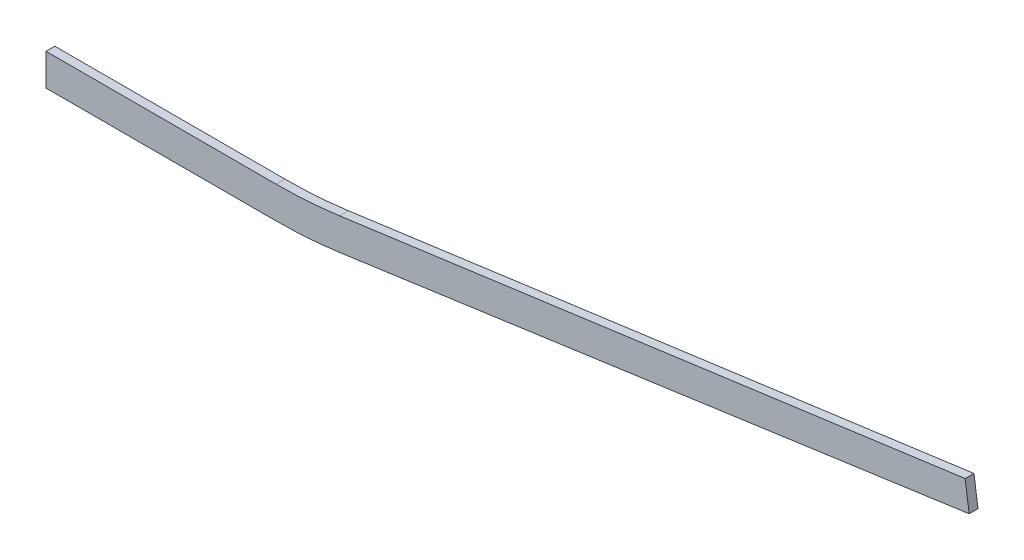
ISO-10303-21;
HEADER;
FILE_DESCRIPTION(('STEP AP214'),'2;1');
FILE_NAME('part.step','',(''),(''),'','','');
FILE_SCHEMA(('AUTOMOTIVE_DESIGN { 1 0 10303 214 1 1 1 1 }'));
ENDSEC;
DATA;
#1=APPLICATION_CONTEXT('core data for automotive mechanical design processes');
#2=APPLICATION_PROTOCOL_DEFINITION('international standard','automotive_design',2000,#1);
#3=PRODUCT_CONTEXT('',#1,'mechanical');
#4=PRODUCT('Part','Part','',(#3));
#5=PRODUCT_RELATED_PRODUCT_CATEGORY('part','',(#4));
#6=PRODUCT_DEFINITION_FORMATION('','',#4);
#7=PRODUCT_DEFINITION_CONTEXT('part definition',#1,'design');
#8=PRODUCT_DEFINITION('design','',#6,#7);
#9=PRODUCT_DEFINITION_SHAPE('','',#8);
#10=(LENGTH_UNIT() NAMED_UNIT(*) SI_UNIT(.MILLI.,.METRE.));
#11=(NAMED_UNIT(*) PLANE_ANGLE_UNIT() SI_UNIT($,.RADIAN.));
#12=(NAMED_UNIT(*) SI_UNIT($,.STERADIAN.) SOLID_ANGLE_UNIT());
#13=UNCERTAINTY_MEASURE_WITH_UNIT(LENGTH_MEASURE(1.E-05),#10,'distance_accuracy_value','');
#14=(GEOMETRIC_REPRESENTATION_CONTEXT(3) GLOBAL_UNCERTAINTY_ASSIGNED_CONTEXT((#13)) GLOBAL_UNIT_ASSIGNED_CONTEXT((#10,
#11,#12)) REPRESENTATION_CONTEXT('',''));
#15=CARTESIAN_POINT('',(0.,0.,0.));
#16=DIRECTION('',(0.,0.,1.));
#17=DIRECTION('',(1.,0.,0.));
#18=AXIS2_PLACEMENT_3D('',#15,#16,#17);
#19=CARTESIAN_POINT('',(3698.44778485167,2129.44349002792,9.525));
#20=DIRECTION('',(0.,1.,0.));
#21=DIRECTION('',(-1.,0.,0.));
#22=AXIS2_PLACEMENT_3D('',#19,#20,#21);
#23=PLANE('',#22);
#24=DIRECTION('',(1.,0.,0.));
#25=VECTOR('',#24,1.);
#26=CARTESIAN_POINT('',(3698.44778485167,2129.44349002792,0.));
#27=LINE('',#26,#25);
#28=CARTESIAN_POINT('',(3698.44778485167,2129.44349002792,0.));
#29=VERTEX_POINT('',#28);
#30=CARTESIAN_POINT('',(3945.49996438437,2129.44349002792,0.));
#31=VERTEX_POINT('',#30);
#32=EDGE_CURVE('E131',#29,#31,#27,.T.);
#33=ORIENTED_EDGE('',*,*,#32,.T.);
#34=DIRECTION('',(0.,0.,-1.));
#35=VECTOR('',#34,1.);
#36=CARTESIAN_POINT('',(3945.49996438437,2129.44349002792,9.525));
#37=LINE('',#36,#35);
#38=CARTESIAN_POINT('',(3945.49996438437,2129.44349002792,9.525));
#39=VERTEX_POINT('',#38);
#40=EDGE_CURVE('E11',#39,#31,#37,.T.);
#41=ORIENTED_EDGE('',*,*,#40,.F.);
#42=DIRECTION('',(1.,0.,0.));
#43=VECTOR('',#42,1.);
#44=CARTESIAN_POINT('',(3698.44778485167,2129.44349002792,9.525));
#45=LINE('',#44,#43);
#46=CARTESIAN_POINT('',(3698.44778485167,2129.44349002792,9.525));
#47=VERTEX_POINT('',#46);
#48=EDGE_CURVE('E145',#47,#39,#45,.T.);
#49=ORIENTED_EDGE('',*,*,#48,.F.);
#50=DIRECTION('',(0.,0.,-1.));
#51=VECTOR('',#50,1.);
#52=CARTESIAN_POINT('',(3698.44778485167,2129.44349002792,9.525));
#53=LINE('',#52,#51);
#54=EDGE_CURVE('E127',#47,#29,#53,.T.);
#55=ORIENTED_EDGE('',*,*,#54,.T.);
#56=EDGE_LOOP('',(#33,#41,#49,#55));
#57=FACE_BOUND('',#56,.T.);
#58=ADVANCED_FACE('F35',(#57),#23,.F.);
#59=CARTESIAN_POINT('',(3945.49996438437,2637.44349002792,9.525));
#60=DIRECTION('',(0.,0.,-1.));
#61=DIRECTION('',(-1.,0.,0.));
#62=AXIS2_PLACEMENT_3D('',#59,#60,#61);
#63=CYLINDRICAL_SURFACE('',#62,508.);
#64=CARTESIAN_POINT('',(3945.49996438437,2637.44349002792,0.));
#65=DIRECTION('',(0.,0.,1.));
#66=DIRECTION('',(1.,0.,0.));
#67=AXIS2_PLACEMENT_3D('',#64,#65,#66);
#68=CIRCLE('',#67,508.);
#69=CARTESIAN_POINT('',(4016.19989967208,2134.3873111072,0.));
#70=VERTEX_POINT('',#69);
#71=EDGE_CURVE('E134',#31,#70,#68,.T.);
#72=ORIENTED_EDGE('',*,*,#71,.T.);
#73=DIRECTION('',(0.,0.,-1.));
#74=VECTOR('',#73,1.);
#75=CARTESIAN_POINT('',(4016.19989967208,2134.3873111072,9.525));
#76=LINE('',#75,#74);
#77=CARTESIAN_POINT('',(4016.19989967208,2134.3873111072,9.525));
#78=VERTEX_POINT('',#77);
#79=EDGE_CURVE('E43',#78,#70,#76,.T.);
#80=ORIENTED_EDGE('',*,*,#79,.F.);
#81=CARTESIAN_POINT('',(3945.49996438437,2637.44349002792,9.525));
#82=DIRECTION('',(0.,0.,1.));
#83=DIRECTION('',(1.,0.,0.));
#84=AXIS2_PLACEMENT_3D('',#81,#82,#83);
#85=CIRCLE('',#84,508.);
#86=EDGE_CURVE('E94',#39,#78,#85,.T.);
#87=ORIENTED_EDGE('',*,*,#86,.F.);
#88=ORIENTED_EDGE('',*,*,#40,.T.);
#89=EDGE_LOOP('',(#72,#80,#87,#88));
#90=FACE_BOUND('',#89,.T.);
#91=ADVANCED_FACE('F180',(#90),#63,.T.);
#92=CARTESIAN_POINT('',(4016.19989967208,2134.3873111072,9.525));
#93=DIRECTION('',(-0.139173100960063,0.990268068741571,0.));
#94=DIRECTION('',(-0.990268068741571,-0.139173100960063,0.));
#95=AXIS2_PLACEMENT_3D('',#92,#93,#94);
#96=PLANE('',#95);
#97=DIRECTION('',(0.990268068741571,0.139173100960063,0.));
#98=VECTOR('',#97,1.);
#99=CARTESIAN_POINT('',(4016.19989967208,2134.3873111072,0.));
#100=LINE('',#99,#98);
#101=CARTESIAN_POINT('',(4694.39778485168,2229.70180798374,0.));
#102=VERTEX_POINT('',#101);
#103=EDGE_CURVE('E136',#70,#102,#100,.T.);
#104=ORIENTED_EDGE('',*,*,#103,.T.);
#105=DIRECTION('',(0.,0.,-1.));
#106=VECTOR('',#105,1.);
#107=CARTESIAN_POINT('',(4694.39778485168,2229.70180798374,9.525));
#108=LINE('',#107,#106);
#109=CARTESIAN_POINT('',(4694.39778485168,2229.70180798374,9.525));
#110=VERTEX_POINT('',#109);
#111=EDGE_CURVE('E152',#110,#102,#108,.T.);
#112=ORIENTED_EDGE('',*,*,#111,.F.);
#113=DIRECTION('',(0.990268068741571,0.139173100960063,0.));
#114=VECTOR('',#113,1.);
#115=CARTESIAN_POINT('',(4016.19989967208,2134.3873111072,9.525));
#116=LINE('',#115,#114);
#117=EDGE_CURVE('E160',#78,#110,#116,.T.);
#118=ORIENTED_EDGE('',*,*,#117,.F.);
#119=ORIENTED_EDGE('',*,*,#79,.T.);
#120=EDGE_LOOP('',(#104,#112,#118,#119));
#121=FACE_BOUND('',#120,.T.);
#122=ADVANCED_FACE('F158',(#121),#96,.F.);
#123=CARTESIAN_POINT('',(4694.39778485168,2229.70180798374,9.525));
#124=DIRECTION('',(-0.99026806874157,-0.139173100960068,0.));
#125=DIRECTION('',(0.139173100960068,-0.99026806874157,0.));
#126=AXIS2_PLACEMENT_3D('',#123,#124,#125);
#127=PLANE('',#126);
#128=DIRECTION('',(-0.139173100960068,0.99026806874157,0.));
#129=VECTOR('',#128,1.);
#130=CARTESIAN_POINT('',(4694.39778485168,2229.70180798374,0.));
#131=LINE('',#130,#129);
#132=CARTESIAN_POINT('',(4690.07128854497,2260.48642880851,0.));
#133=VERTEX_POINT('',#132);
#134=EDGE_CURVE('E138',#102,#133,#131,.T.);
#135=ORIENTED_EDGE('',*,*,#134,.T.);
#136=DIRECTION('',(0.,0.,-1.));
#137=VECTOR('',#136,1.);
#138=CARTESIAN_POINT('',(4690.07128854497,2260.48642880851,9.525));
#139=LINE('',#138,#137);
#140=CARTESIAN_POINT('',(4690.07128854497,2260.48642880851,9.525));
#141=VERTEX_POINT('',#140);
#142=EDGE_CURVE('E149',#141,#133,#139,.T.);
#143=ORIENTED_EDGE('',*,*,#142,.F.);
#144=DIRECTION('',(-0.139173100960068,0.99026806874157,0.));
#145=VECTOR('',#144,1.);
#146=CARTESIAN_POINT('',(4694.39778485168,2229.70180798374,9.525));
#147=LINE('',#146,#145);
#148=EDGE_CURVE('E172',#110,#141,#147,.T.);
#149=ORIENTED_EDGE('',*,*,#148,.F.);
#150=ORIENTED_EDGE('',*,*,#111,.T.);
#151=EDGE_LOOP('',(#135,#143,#149,#150));
#152=FACE_BOUND('',#151,.T.);
#153=ADVANCED_FACE('F168',(#152),#127,.F.);
#154=CARTESIAN_POINT('',(4015.17134913609,2168.48818137953,9.525));
#155=DIRECTION('',(0.135064830199822,-0.990836763368767,0.));
#156=DIRECTION('',(0.990836763368767,0.135064830199822,0.));
#157=AXIS2_PLACEMENT_3D('',#154,#155,#156);
#158=PLANE('',#157);
#159=DIRECTION('',(-0.990836763368767,-0.135064830199822,0.));
#160=VECTOR('',#159,1.);
#161=CARTESIAN_POINT('',(4015.17134913609,2168.48818137953,0.));
#162=LINE('',#161,#160);
#163=CARTESIAN_POINT('',(4015.17134913609,2168.48818137953,0.));
#164=VERTEX_POINT('',#163);
#165=EDGE_CURVE('E140',#133,#164,#162,.T.);
#166=ORIENTED_EDGE('',*,*,#165,.T.);
#167=DIRECTION('',(0.,0.,-1.));
#168=VECTOR('',#167,1.);
#169=CARTESIAN_POINT('',(4015.17134913609,2168.48818137953,9.525));
#170=LINE('',#169,#168);
#171=CARTESIAN_POINT('',(4015.17134913609,2168.48818137953,9.525));
#172=VERTEX_POINT('',#171);
#173=EDGE_CURVE('E122',#172,#164,#170,.T.);
#174=ORIENTED_EDGE('',*,*,#173,.F.);
#175=DIRECTION('',(-0.990836763368767,-0.135064830199822,0.));
#176=VECTOR('',#175,1.);
#177=CARTESIAN_POINT('',(4015.17134913609,2168.48818137953,9.525));
#178=LINE('',#177,#176);
#179=EDGE_CURVE('E113',#141,#172,#178,.T.);
#180=ORIENTED_EDGE('',*,*,#179,.F.);
#181=ORIENTED_EDGE('',*,*,#142,.T.);
#182=EDGE_LOOP('',(#166,#174,#180,#181));
#183=FACE_BOUND('',#182,.T.);
#184=ADVANCED_FACE('F171',(#183),#158,.F.);
#185=CARTESIAN_POINT('',(3946.55841539458,2671.83325717087,9.525));
#186=DIRECTION('',(0.,0.,-1.));
#187=DIRECTION('',(-1.,0.,0.));
#188=AXIS2_PLACEMENT_3D('',#185,#186,#187);
#189=CYLINDRICAL_SURFACE('',#188,508.);
#190=CARTESIAN_POINT('',(3946.55841539458,2671.83325717087,0.));
#191=DIRECTION('',(0.,0.,-1.));
#192=DIRECTION('',(1.,0.,0.));
#193=AXIS2_PLACEMENT_3D('',#190,#191,#192);
#194=CIRCLE('',#193,508.);
#195=CARTESIAN_POINT('',(3946.55841539458,2163.83325717087,0.));
#196=VERTEX_POINT('',#195);
#197=EDGE_CURVE('E121',#164,#196,#194,.T.);
#198=ORIENTED_EDGE('',*,*,#197,.T.);
#199=DIRECTION('',(0.,0.,-1.));
#200=VECTOR('',#199,1.);
#201=CARTESIAN_POINT('',(3946.55841539458,2163.83325717087,9.525));
#202=LINE('',#201,#200);
#203=CARTESIAN_POINT('',(3946.55841539458,2163.83325717087,9.525));
#204=VERTEX_POINT('',#203);
#205=EDGE_CURVE('E118',#204,#196,#202,.T.);
#206=ORIENTED_EDGE('',*,*,#205,.F.);
#207=CARTESIAN_POINT('',(3946.55841539458,2671.83325717087,9.525));
#208=DIRECTION('',(0.,0.,-1.));
#209=DIRECTION('',(1.,0.,0.));
#210=AXIS2_PLACEMENT_3D('',#207,#208,#209);
#211=CIRCLE('',#210,508.);
#212=EDGE_CURVE('E107',#172,#204,#211,.T.);
#213=ORIENTED_EDGE('',*,*,#212,.F.);
#214=ORIENTED_EDGE('',*,*,#173,.T.);
#215=EDGE_LOOP('',(#198,#206,#213,#214));
#216=FACE_BOUND('',#215,.T.);
#217=ADVANCED_FACE('F119',(#216),#189,.F.);
#218=CARTESIAN_POINT('',(3698.44778485167,2163.83325717087,9.525));
#219=DIRECTION('',(0.,-1.,0.));
#220=DIRECTION('',(0.,0.,-1.));
#221=AXIS2_PLACEMENT_3D('',#218,#219,#220);
#222=PLANE('',#221);
#223=DIRECTION('',(-1.,0.,0.));
#224=VECTOR('',#223,1.);
#225=CARTESIAN_POINT('',(3698.44778485167,2163.83325717087,0.));
#226=LINE('',#225,#224);
#227=CARTESIAN_POINT('',(3698.44778485167,2163.83325717087,0.));
#228=VERTEX_POINT('',#227);
#229=EDGE_CURVE('E80',#196,#228,#226,.T.);
#230=ORIENTED_EDGE('',*,*,#229,.T.);
#231=DIRECTION('',(0.,0.,-1.));
#232=VECTOR('',#231,1.);
#233=CARTESIAN_POINT('',(3698.44778485167,2163.83325717087,9.525));
#234=LINE('',#233,#232);
#235=CARTESIAN_POINT('',(3698.44778485167,2163.83325717087,9.525));
#236=VERTEX_POINT('',#235);
#237=EDGE_CURVE('E123',#236,#228,#234,.T.);
#238=ORIENTED_EDGE('',*,*,#237,.F.);
#239=DIRECTION('',(-1.,0.,0.));
#240=VECTOR('',#239,1.);
#241=CARTESIAN_POINT('',(3698.44778485167,2163.83325717087,9.525));
#242=LINE('',#241,#240);
#243=EDGE_CURVE('E111',#204,#236,#242,.T.);
#244=ORIENTED_EDGE('',*,*,#243,.F.);
#245=ORIENTED_EDGE('',*,*,#205,.T.);
#246=EDGE_LOOP('',(#230,#238,#244,#245));
#247=FACE_BOUND('',#246,.T.);
#248=ADVANCED_FACE('F125',(#247),#222,.F.);
#249=CARTESIAN_POINT('',(3698.44778485167,2129.44349002792,9.525));
#250=DIRECTION('',(1.,0.,0.));
#251=DIRECTION('',(0.,0.,-1.));
#252=AXIS2_PLACEMENT_3D('',#249,#250,#251);
#253=PLANE('',#252);
#254=DIRECTION('',(0.,-1.,0.));
#255=VECTOR('',#254,1.);
#256=CARTESIAN_POINT('',(3698.44778485167,2129.44349002792,0.));
#257=LINE('',#256,#255);
#258=EDGE_CURVE('E86',#228,#29,#257,.T.);
#259=ORIENTED_EDGE('',*,*,#258,.T.);
#260=ORIENTED_EDGE('',*,*,#54,.F.);
#261=DIRECTION('',(0.,-1.,0.));
#262=VECTOR('',#261,1.);
#263=CARTESIAN_POINT('',(3698.44778485167,2129.44349002792,9.525));
#264=LINE('',#263,#262);
#265=EDGE_CURVE('E51',#236,#47,#264,.T.);
#266=ORIENTED_EDGE('',*,*,#265,.F.);
#267=ORIENTED_EDGE('',*,*,#237,.T.);
#268=EDGE_LOOP('',(#259,#260,#266,#267));
#269=FACE_BOUND('',#268,.T.);
#270=ADVANCED_FACE('F196',(#269),#253,.F.);
#271=CARTESIAN_POINT('',(3945.49996438437,2637.44349002792,9.525));
#272=DIRECTION('',(0.,0.,1.));
#273=DIRECTION('',(1.,0.,0.));
#274=AXIS2_PLACEMENT_3D('',#271,#272,#273);
#275=PLANE('',#274);
#276=ORIENTED_EDGE('',*,*,#48,.T.);
#277=ORIENTED_EDGE('',*,*,#86,.T.);
#278=ORIENTED_EDGE('',*,*,#117,.T.);
#279=ORIENTED_EDGE('',*,*,#148,.T.);
#280=ORIENTED_EDGE('',*,*,#179,.T.);
#281=ORIENTED_EDGE('',*,*,#212,.T.);
#282=ORIENTED_EDGE('',*,*,#243,.T.);
#283=ORIENTED_EDGE('',*,*,#265,.T.);
#284=EDGE_LOOP('',(#276,#277,#278,#279,#280,#281,#282,#283));
#285=FACE_BOUND('',#284,.T.);
#286=ADVANCED_FACE('F109',(#285),#275,.T.);
#287=CARTESIAN_POINT('',(3945.49996438437,2637.44349002792,0.));
#288=DIRECTION('',(0.,0.,1.));
#289=DIRECTION('',(1.,0.,0.));
#290=AXIS2_PLACEMENT_3D('',#287,#288,#289);
#291=PLANE('',#290);
#292=ORIENTED_EDGE('',*,*,#32,.F.);
#293=ORIENTED_EDGE('',*,*,#258,.F.);
#294=ORIENTED_EDGE('',*,*,#229,.F.);
#295=ORIENTED_EDGE('',*,*,#197,.F.);
#296=ORIENTED_EDGE('',*,*,#165,.F.);
#297=ORIENTED_EDGE('',*,*,#134,.F.);
#298=ORIENTED_EDGE('',*,*,#103,.F.);
#299=ORIENTED_EDGE('',*,*,#71,.F.);
#300=EDGE_LOOP('',(#292,#293,#294,#295,#296,#297,#298,#299));
#301=FACE_BOUND('',#300,.T.);
#302=ADVANCED_FACE('F164',(#301),#291,.F.);
#303=CLOSED_SHELL('',(#58,#91,#122,#153,#184,#217,#248,#270,#286,#302));
#304=MANIFOLD_SOLID_BREP('B2',#303);
#305=ADVANCED_BREP_SHAPE_REPRESENTATION('',(#18,#304),#14);
#306=SHAPE_DEFINITION_REPRESENTATION(#9,#305);
ENDSEC;
END-ISO-10303-21;
